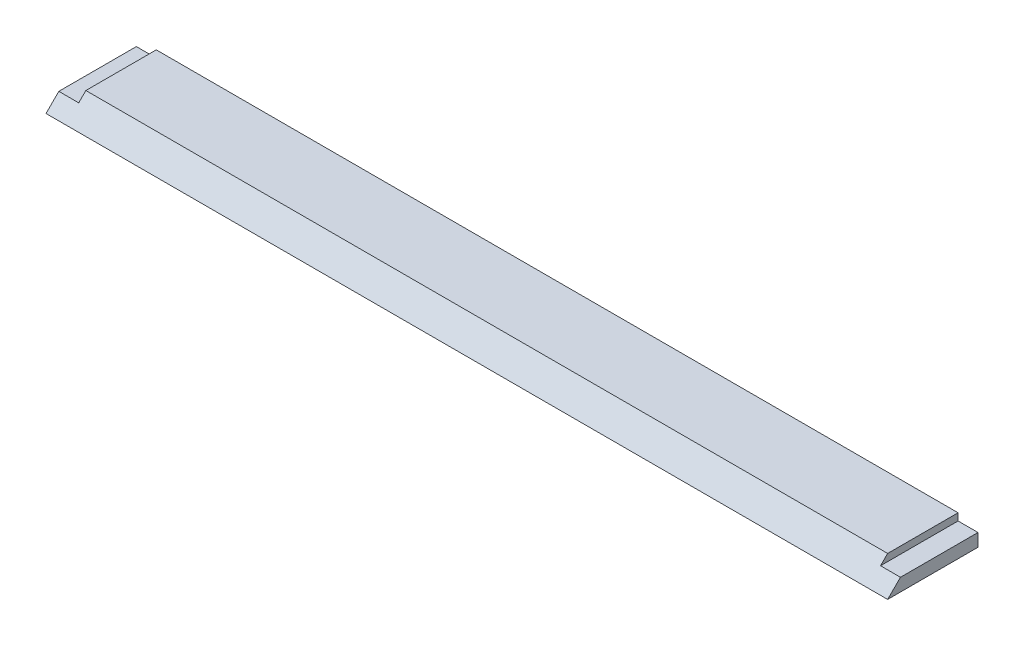
ISO-10303-21;
HEADER;
FILE_DESCRIPTION(('STEP AP214'),'2;1');
FILE_NAME('part.step','',(''),(''),'','','');
FILE_SCHEMA(('AUTOMOTIVE_DESIGN { 1 0 10303 214 1 1 1 1 }'));
ENDSEC;
DATA;
#1=APPLICATION_CONTEXT('core data for automotive mechanical design processes');
#2=APPLICATION_PROTOCOL_DEFINITION('international standard','automotive_design',2000,#1);
#3=PRODUCT_CONTEXT('',#1,'mechanical');
#4=PRODUCT('Part','Part','',(#3));
#5=PRODUCT_RELATED_PRODUCT_CATEGORY('part','',(#4));
#6=PRODUCT_DEFINITION_FORMATION('','',#4);
#7=PRODUCT_DEFINITION_CONTEXT('part definition',#1,'design');
#8=PRODUCT_DEFINITION('design','',#6,#7);
#9=PRODUCT_DEFINITION_SHAPE('','',#8);
#10=(LENGTH_UNIT() NAMED_UNIT(*) SI_UNIT(.MILLI.,.METRE.));
#11=(NAMED_UNIT(*) PLANE_ANGLE_UNIT() SI_UNIT($,.RADIAN.));
#12=(NAMED_UNIT(*) SI_UNIT($,.STERADIAN.) SOLID_ANGLE_UNIT());
#13=UNCERTAINTY_MEASURE_WITH_UNIT(LENGTH_MEASURE(1.E-05),#10,'distance_accuracy_value','');
#14=(GEOMETRIC_REPRESENTATION_CONTEXT(3) GLOBAL_UNCERTAINTY_ASSIGNED_CONTEXT((#13)) GLOBAL_UNIT_ASSIGNED_CONTEXT((#10,
#11,#12)) REPRESENTATION_CONTEXT('',''));
#15=CARTESIAN_POINT('',(0.,0.,0.));
#16=DIRECTION('',(0.,0.,1.));
#17=DIRECTION('',(1.,0.,0.));
#18=AXIS2_PLACEMENT_3D('',#15,#16,#17);
#19=CARTESIAN_POINT('',(-32.3514285714286,2.8,-17.9864285714286));
#20=DIRECTION('',(1.,0.,0.));
#21=DIRECTION('',(0.,0.,-1.));
#22=AXIS2_PLACEMENT_3D('',#19,#20,#21);
#23=PLANE('',#22);
#24=DIRECTION('',(0.,0.,1.));
#25=VECTOR('',#24,1.);
#26=CARTESIAN_POINT('',(-32.3514285714286,0.,-17.9864285714286));
#27=LINE('',#26,#25);
#28=CARTESIAN_POINT('',(-32.3514285714286,0.,-17.9864285714286));
#29=VERTEX_POINT('',#28);
#30=CARTESIAN_POINT('',(-32.3514285714286,0.,-5.28642857142857));
#31=VERTEX_POINT('',#30);
#32=EDGE_CURVE('E114',#29,#31,#27,.T.);
#33=ORIENTED_EDGE('',*,*,#32,.T.);
#34=DIRECTION('',(0.,0.707106781186551,-0.707106781186544));
#35=VECTOR('',#34,1.);
#36=CARTESIAN_POINT('',(-32.3514285714286,2.8,-8.08642857142854));
#37=LINE('',#36,#35);
#38=CARTESIAN_POINT('',(-32.3514285714286,1.8,-7.08642857142855));
#39=VERTEX_POINT('',#38);
#40=EDGE_CURVE('E97',#31,#39,#37,.T.);
#41=ORIENTED_EDGE('',*,*,#40,.T.);
#42=DIRECTION('',(0.,0.,1.));
#43=VECTOR('',#42,1.);
#44=CARTESIAN_POINT('',(-32.3514285714286,1.8,-17.9864285714286));
#45=LINE('',#44,#43);
#46=CARTESIAN_POINT('',(-32.3514285714286,1.8,-17.9864285714286));
#47=VERTEX_POINT('',#46);
#48=EDGE_CURVE('E163',#47,#39,#45,.T.);
#49=ORIENTED_EDGE('',*,*,#48,.F.);
#50=DIRECTION('',(0.,-1.,0.));
#51=VECTOR('',#50,1.);
#52=CARTESIAN_POINT('',(-32.3514285714286,2.8,-17.9864285714286));
#53=LINE('',#52,#51);
#54=EDGE_CURVE('E119',#47,#29,#53,.T.);
#55=ORIENTED_EDGE('',*,*,#54,.T.);
#56=EDGE_LOOP('',(#33,#41,#49,#55));
#57=FACE_BOUND('',#56,.T.);
#58=ADVANCED_FACE('F35',(#57),#23,.F.);
#59=CARTESIAN_POINT('',(85.9485714285714,2.8,-17.9864285714286));
#60=DIRECTION('',(-1.,0.,0.));
#61=DIRECTION('',(0.,0.,1.));
#62=AXIS2_PLACEMENT_3D('',#59,#60,#61);
#63=PLANE('',#62);
#64=DIRECTION('',(0.,0.,-1.));
#65=VECTOR('',#64,1.);
#66=CARTESIAN_POINT('',(85.9485714285714,1.8,-17.9864285714286));
#67=LINE('',#66,#65);
#68=CARTESIAN_POINT('',(85.9485714285714,1.8,-7.08642857142855));
#69=VERTEX_POINT('',#68);
#70=CARTESIAN_POINT('',(85.9485714285714,1.8,-17.9864285714286));
#71=VERTEX_POINT('',#70);
#72=EDGE_CURVE('E142',#69,#71,#67,.T.);
#73=ORIENTED_EDGE('',*,*,#72,.F.);
#74=DIRECTION('',(0.,0.707106781186551,-0.707106781186544));
#75=VECTOR('',#74,1.);
#76=CARTESIAN_POINT('',(85.9485714285714,2.8,-8.08642857142854));
#77=LINE('',#76,#75);
#78=CARTESIAN_POINT('',(85.9485714285714,0.,-5.28642857142857));
#79=VERTEX_POINT('',#78);
#80=EDGE_CURVE('E49',#79,#69,#77,.T.);
#81=ORIENTED_EDGE('',*,*,#80,.F.);
#82=DIRECTION('',(0.,0.,-1.));
#83=VECTOR('',#82,1.);
#84=CARTESIAN_POINT('',(85.9485714285714,0.,-17.9864285714286));
#85=LINE('',#84,#83);
#86=CARTESIAN_POINT('',(85.9485714285714,0.,-17.9864285714286));
#87=VERTEX_POINT('',#86);
#88=EDGE_CURVE('E116',#79,#87,#85,.T.);
#89=ORIENTED_EDGE('',*,*,#88,.T.);
#90=DIRECTION('',(0.,-1.,0.));
#91=VECTOR('',#90,1.);
#92=CARTESIAN_POINT('',(85.9485714285714,2.8,-17.9864285714286));
#93=LINE('',#92,#91);
#94=EDGE_CURVE('E42',#71,#87,#93,.T.);
#95=ORIENTED_EDGE('',*,*,#94,.F.);
#96=EDGE_LOOP('',(#73,#81,#89,#95));
#97=FACE_BOUND('',#96,.T.);
#98=ADVANCED_FACE('F141',(#97),#63,.F.);
#99=CARTESIAN_POINT('',(-32.3514285714286,2.8,-17.9864285714286));
#100=DIRECTION('',(0.,0.,1.));
#101=DIRECTION('',(1.,0.,0.));
#102=AXIS2_PLACEMENT_3D('',#99,#100,#101);
#103=PLANE('',#102);
#104=DIRECTION('',(-1.,0.,0.));
#105=VECTOR('',#104,1.);
#106=CARTESIAN_POINT('',(-32.3514285714286,2.8,-17.9864285714286));
#107=LINE('',#106,#105);
#108=CARTESIAN_POINT('',(83.1485714285714,2.8,-17.9864285714286));
#109=VERTEX_POINT('',#108);
#110=CARTESIAN_POINT('',(-29.5514285714286,2.8,-17.9864285714286));
#111=VERTEX_POINT('',#110);
#112=EDGE_CURVE('E127',#109,#111,#107,.T.);
#113=ORIENTED_EDGE('',*,*,#112,.F.);
#114=DIRECTION('',(0.,1.,0.));
#115=VECTOR('',#114,1.);
#116=CARTESIAN_POINT('',(83.1485714285714,1.8,-17.9864285714286));
#117=LINE('',#116,#115);
#118=CARTESIAN_POINT('',(83.1485714285714,1.8,-17.9864285714286));
#119=VERTEX_POINT('',#118);
#120=EDGE_CURVE('E56',#119,#109,#117,.T.);
#121=ORIENTED_EDGE('',*,*,#120,.F.);
#122=DIRECTION('',(-1.,0.,0.));
#123=VECTOR('',#122,1.);
#124=CARTESIAN_POINT('',(85.9485714285714,1.8,-17.9864285714286));
#125=LINE('',#124,#123);
#126=EDGE_CURVE('E138',#71,#119,#125,.T.);
#127=ORIENTED_EDGE('',*,*,#126,.F.);
#128=ORIENTED_EDGE('',*,*,#94,.T.);
#129=DIRECTION('',(-1.,0.,0.));
#130=VECTOR('',#129,1.);
#131=CARTESIAN_POINT('',(-32.3514285714286,0.,-17.9864285714286));
#132=LINE('',#131,#130);
#133=EDGE_CURVE('E130',#87,#29,#132,.T.);
#134=ORIENTED_EDGE('',*,*,#133,.T.);
#135=ORIENTED_EDGE('',*,*,#54,.F.);
#136=DIRECTION('',(-1.,0.,0.));
#137=VECTOR('',#136,1.);
#138=CARTESIAN_POINT('',(-32.3514285714286,1.8,-17.9864285714286));
#139=LINE('',#138,#137);
#140=CARTESIAN_POINT('',(-29.5514285714286,1.8,-17.9864285714286));
#141=VERTEX_POINT('',#140);
#142=EDGE_CURVE('E124',#141,#47,#139,.T.);
#143=ORIENTED_EDGE('',*,*,#142,.F.);
#144=DIRECTION('',(0.,1.,0.));
#145=VECTOR('',#144,1.);
#146=CARTESIAN_POINT('',(-29.5514285714286,1.8,-17.9864285714286));
#147=LINE('',#146,#145);
#148=EDGE_CURVE('E121',#141,#111,#147,.T.);
#149=ORIENTED_EDGE('',*,*,#148,.T.);
#150=EDGE_LOOP('',(#113,#121,#127,#128,#134,#135,#143,#149));
#151=FACE_BOUND('',#150,.T.);
#152=ADVANCED_FACE('F136',(#151),#103,.F.);
#153=CARTESIAN_POINT('',(0.,2.8,0.));
#154=DIRECTION('',(0.,1.,0.));
#155=DIRECTION('',(0.,0.,1.));
#156=AXIS2_PLACEMENT_3D('',#153,#154,#155);
#157=PLANE('',#156);
#158=DIRECTION('',(1.,0.,0.));
#159=VECTOR('',#158,1.);
#160=CARTESIAN_POINT('',(-32.3514285714286,2.8,-8.08642857142854));
#161=LINE('',#160,#159);
#162=CARTESIAN_POINT('',(-29.5514285714286,2.8,-8.08642857142854));
#163=VERTEX_POINT('',#162);
#164=CARTESIAN_POINT('',(83.1485714285714,2.8,-8.08642857142854));
#165=VERTEX_POINT('',#164);
#166=EDGE_CURVE('E107',#163,#165,#161,.T.);
#167=ORIENTED_EDGE('',*,*,#166,.T.);
#168=DIRECTION('',(0.,0.,1.));
#169=VECTOR('',#168,1.);
#170=CARTESIAN_POINT('',(83.1485714285714,2.8,-17.9864285714286));
#171=LINE('',#170,#169);
#172=EDGE_CURVE('E154',#109,#165,#171,.T.);
#173=ORIENTED_EDGE('',*,*,#172,.F.);
#174=ORIENTED_EDGE('',*,*,#112,.T.);
#175=DIRECTION('',(0.,0.,-1.));
#176=VECTOR('',#175,1.);
#177=CARTESIAN_POINT('',(-29.5514285714286,2.8,-17.9864285714286));
#178=LINE('',#177,#176);
#179=EDGE_CURVE('E162',#163,#111,#178,.T.);
#180=ORIENTED_EDGE('',*,*,#179,.F.);
#181=EDGE_LOOP('',(#167,#173,#174,#180));
#182=FACE_BOUND('',#181,.T.);
#183=ADVANCED_FACE('F176',(#182),#157,.T.);
#184=CARTESIAN_POINT('',(0.,0.,0.));
#185=DIRECTION('',(0.,1.,0.));
#186=DIRECTION('',(0.,0.,1.));
#187=AXIS2_PLACEMENT_3D('',#184,#185,#186);
#188=PLANE('',#187);
#189=ORIENTED_EDGE('',*,*,#32,.F.);
#190=ORIENTED_EDGE('',*,*,#133,.F.);
#191=ORIENTED_EDGE('',*,*,#88,.F.);
#192=DIRECTION('',(1.,0.,0.));
#193=VECTOR('',#192,1.);
#194=CARTESIAN_POINT('',(-32.3514285714286,0.,-5.28642857142857));
#195=LINE('',#194,#193);
#196=EDGE_CURVE('E100',#31,#79,#195,.T.);
#197=ORIENTED_EDGE('',*,*,#196,.F.);
#198=EDGE_LOOP('',(#189,#190,#191,#197));
#199=FACE_BOUND('',#198,.T.);
#200=ADVANCED_FACE('F112',(#199),#188,.F.);
#201=CARTESIAN_POINT('',(-29.5514285714286,1.8,-17.9864285714286));
#202=DIRECTION('',(1.,0.,0.));
#203=DIRECTION('',(0.,0.,-1.));
#204=AXIS2_PLACEMENT_3D('',#201,#202,#203);
#205=PLANE('',#204);
#206=DIRECTION('',(0.,0.,-1.));
#207=VECTOR('',#206,1.);
#208=CARTESIAN_POINT('',(-29.5514285714286,1.8,-17.9864285714286));
#209=LINE('',#208,#207);
#210=CARTESIAN_POINT('',(-29.5514285714286,1.8,-7.08642857142855));
#211=VERTEX_POINT('',#210);
#212=EDGE_CURVE('E165',#211,#141,#209,.T.);
#213=ORIENTED_EDGE('',*,*,#212,.F.);
#214=DIRECTION('',(0.,0.707106781186551,-0.707106781186544));
#215=VECTOR('',#214,1.);
#216=CARTESIAN_POINT('',(-29.5514285714286,7.25000000000001,-12.5364285714285));
#217=LINE('',#216,#215);
#218=EDGE_CURVE('E151',#211,#163,#217,.T.);
#219=ORIENTED_EDGE('',*,*,#218,.T.);
#220=ORIENTED_EDGE('',*,*,#179,.T.);
#221=ORIENTED_EDGE('',*,*,#148,.F.);
#222=EDGE_LOOP('',(#213,#219,#220,#221));
#223=FACE_BOUND('',#222,.T.);
#224=ADVANCED_FACE('F173',(#223),#205,.F.);
#225=CARTESIAN_POINT('',(0.,1.8,0.));
#226=DIRECTION('',(0.,1.,0.));
#227=DIRECTION('',(0.,0.,1.));
#228=AXIS2_PLACEMENT_3D('',#225,#226,#227);
#229=PLANE('',#228);
#230=DIRECTION('',(-1.,0.,0.));
#231=VECTOR('',#230,1.);
#232=CARTESIAN_POINT('',(0.,1.8,-7.08642857142855));
#233=LINE('',#232,#231);
#234=EDGE_CURVE('E102',#211,#39,#233,.T.);
#235=ORIENTED_EDGE('',*,*,#234,.F.);
#236=ORIENTED_EDGE('',*,*,#212,.T.);
#237=ORIENTED_EDGE('',*,*,#142,.T.);
#238=ORIENTED_EDGE('',*,*,#48,.T.);
#239=EDGE_LOOP('',(#235,#236,#237,#238));
#240=FACE_BOUND('',#239,.T.);
#241=ADVANCED_FACE('F178',(#240),#229,.T.);
#242=CARTESIAN_POINT('',(83.1485714285714,1.8,-17.9864285714286));
#243=DIRECTION('',(-1.,0.,0.));
#244=DIRECTION('',(0.,0.,1.));
#245=AXIS2_PLACEMENT_3D('',#242,#243,#244);
#246=PLANE('',#245);
#247=ORIENTED_EDGE('',*,*,#172,.T.);
#248=DIRECTION('',(0.,-0.707106781186551,0.707106781186544));
#249=VECTOR('',#248,1.);
#250=CARTESIAN_POINT('',(83.1485714285714,7.25000000000001,-12.5364285714285));
#251=LINE('',#250,#249);
#252=CARTESIAN_POINT('',(83.1485714285714,1.8,-7.08642857142855));
#253=VERTEX_POINT('',#252);
#254=EDGE_CURVE('E147',#165,#253,#251,.T.);
#255=ORIENTED_EDGE('',*,*,#254,.T.);
#256=DIRECTION('',(0.,0.,1.));
#257=VECTOR('',#256,1.);
#258=CARTESIAN_POINT('',(83.1485714285714,1.8,-17.9864285714286));
#259=LINE('',#258,#257);
#260=EDGE_CURVE('E157',#119,#253,#259,.T.);
#261=ORIENTED_EDGE('',*,*,#260,.F.);
#262=ORIENTED_EDGE('',*,*,#120,.T.);
#263=EDGE_LOOP('',(#247,#255,#261,#262));
#264=FACE_BOUND('',#263,.T.);
#265=ADVANCED_FACE('F180',(#264),#246,.F.);
#266=CARTESIAN_POINT('',(0.,1.8,0.));
#267=DIRECTION('',(0.,-1.,0.));
#268=DIRECTION('',(0.,0.,-1.));
#269=AXIS2_PLACEMENT_3D('',#266,#267,#268);
#270=PLANE('',#269);
#271=ORIENTED_EDGE('',*,*,#260,.T.);
#272=DIRECTION('',(1.,0.,0.));
#273=VECTOR('',#272,1.);
#274=CARTESIAN_POINT('',(0.,1.8,-7.08642857142855));
#275=LINE('',#274,#273);
#276=EDGE_CURVE('E11',#253,#69,#275,.T.);
#277=ORIENTED_EDGE('',*,*,#276,.T.);
#278=ORIENTED_EDGE('',*,*,#72,.T.);
#279=ORIENTED_EDGE('',*,*,#126,.T.);
#280=EDGE_LOOP('',(#271,#277,#278,#279));
#281=FACE_BOUND('',#280,.T.);
#282=ADVANCED_FACE('F186',(#281),#270,.F.);
#283=CARTESIAN_POINT('',(-32.3514285714286,2.8,-8.08642857142854));
#284=DIRECTION('',(0.,-0.707106781186543,-0.707106781186551));
#285=DIRECTION('',(0.,0.707106781186551,-0.707106781186544));
#286=AXIS2_PLACEMENT_3D('',#283,#284,#285);
#287=PLANE('',#286);
#288=ORIENTED_EDGE('',*,*,#234,.T.);
#289=ORIENTED_EDGE('',*,*,#40,.F.);
#290=ORIENTED_EDGE('',*,*,#196,.T.);
#291=ORIENTED_EDGE('',*,*,#80,.T.);
#292=ORIENTED_EDGE('',*,*,#276,.F.);
#293=ORIENTED_EDGE('',*,*,#254,.F.);
#294=ORIENTED_EDGE('',*,*,#166,.F.);
#295=ORIENTED_EDGE('',*,*,#218,.F.);
#296=EDGE_LOOP('',(#288,#289,#290,#291,#292,#293,#294,#295));
#297=FACE_BOUND('',#296,.T.);
#298=ADVANCED_FACE('F99',(#297),#287,.F.);
#299=CLOSED_SHELL('',(#58,#98,#152,#183,#200,#224,#241,#265,#282,#298));
#300=MANIFOLD_SOLID_BREP('B2',#299);
#301=ADVANCED_BREP_SHAPE_REPRESENTATION('',(#18,#300),#14);
#302=SHAPE_DEFINITION_REPRESENTATION(#9,#301);
ENDSEC;
END-ISO-10303-21;
